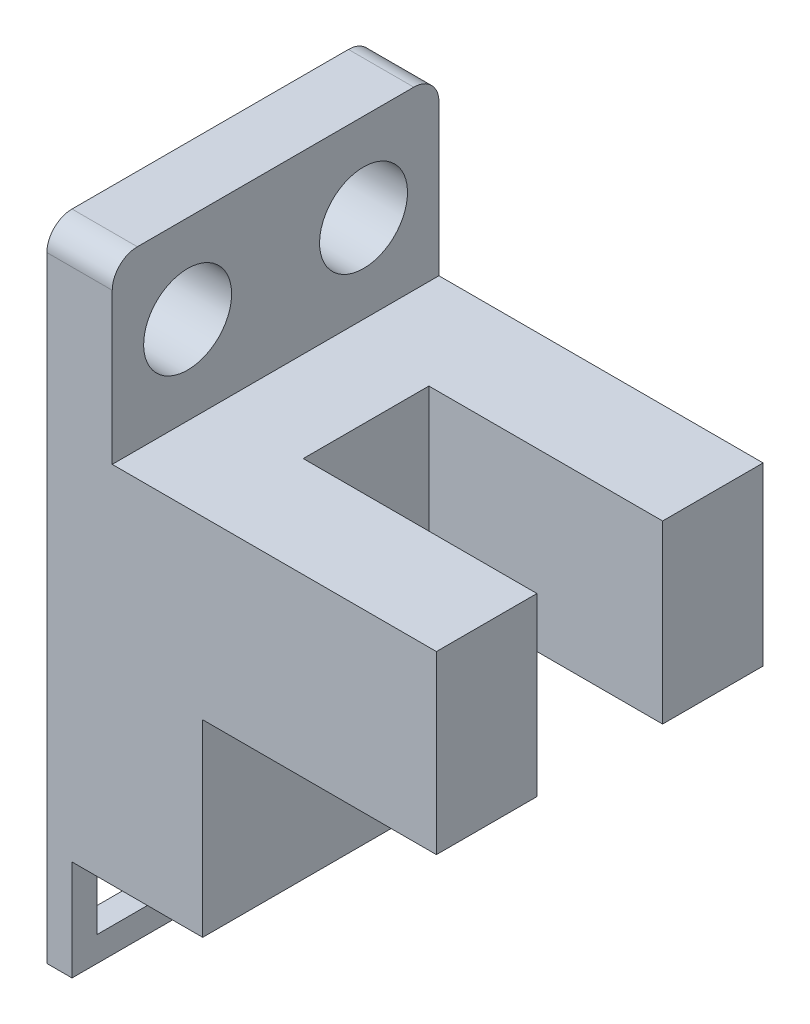
ISO-10303-21;
HEADER;
FILE_DESCRIPTION(('STEP AP214'),'2;1');
FILE_NAME('part.step','',(''),(''),'','','');
FILE_SCHEMA(('AUTOMOTIVE_DESIGN { 1 0 10303 214 1 1 1 1 }'));
ENDSEC;
DATA;
#1=APPLICATION_CONTEXT('core data for automotive mechanical design processes');
#2=APPLICATION_PROTOCOL_DEFINITION('international standard','automotive_design',2000,#1);
#3=PRODUCT_CONTEXT('',#1,'mechanical');
#4=PRODUCT('Part','Part','',(#3));
#5=PRODUCT_RELATED_PRODUCT_CATEGORY('part','',(#4));
#6=PRODUCT_DEFINITION_FORMATION('','',#4);
#7=PRODUCT_DEFINITION_CONTEXT('part definition',#1,'design');
#8=PRODUCT_DEFINITION('design','',#6,#7);
#9=PRODUCT_DEFINITION_SHAPE('','',#8);
#10=(LENGTH_UNIT() NAMED_UNIT(*) SI_UNIT(.MILLI.,.METRE.));
#11=(NAMED_UNIT(*) PLANE_ANGLE_UNIT() SI_UNIT($,.RADIAN.));
#12=(NAMED_UNIT(*) SI_UNIT($,.STERADIAN.) SOLID_ANGLE_UNIT());
#13=UNCERTAINTY_MEASURE_WITH_UNIT(LENGTH_MEASURE(1.E-05),#10,'distance_accuracy_value','');
#14=(GEOMETRIC_REPRESENTATION_CONTEXT(3) GLOBAL_UNCERTAINTY_ASSIGNED_CONTEXT((#13)) GLOBAL_UNIT_ASSIGNED_CONTEXT((#10,
#11,#12)) REPRESENTATION_CONTEXT('',''));
#15=CARTESIAN_POINT('',(0.,0.,0.));
#16=DIRECTION('',(0.,0.,1.));
#17=DIRECTION('',(1.,0.,0.));
#18=AXIS2_PLACEMENT_3D('',#15,#16,#17);
#19=CARTESIAN_POINT('',(0.,0.,6.5));
#20=DIRECTION('',(0.,1.,0.));
#21=DIRECTION('',(0.,0.,1.));
#22=AXIS2_PLACEMENT_3D('',#19,#20,#21);
#23=PLANE('',#22);
#24=DIRECTION('',(0.,0.,-1.));
#25=VECTOR('',#24,1.);
#26=CARTESIAN_POINT('',(9.3,0.,6.5));
#27=LINE('',#26,#25);
#28=CARTESIAN_POINT('',(9.3,0.,-2.5));
#29=VERTEX_POINT('',#28);
#30=CARTESIAN_POINT('',(9.3,0.,-6.5));
#31=VERTEX_POINT('',#30);
#32=EDGE_CURVE('E338',#29,#31,#27,.T.);
#33=ORIENTED_EDGE('',*,*,#32,.F.);
#34=DIRECTION('',(1.,0.,0.));
#35=VECTOR('',#34,1.);
#36=CARTESIAN_POINT('',(0.,0.,-2.5));
#37=LINE('',#36,#35);
#38=CARTESIAN_POINT('',(0.,0.,-2.5));
#39=VERTEX_POINT('',#38);
#40=EDGE_CURVE('E284',#39,#29,#37,.T.);
#41=ORIENTED_EDGE('',*,*,#40,.F.);
#42=DIRECTION('',(0.,0.,-1.));
#43=VECTOR('',#42,1.);
#44=CARTESIAN_POINT('',(0.,0.,6.5));
#45=LINE('',#44,#43);
#46=CARTESIAN_POINT('',(0.,0.,-6.5));
#47=VERTEX_POINT('',#46);
#48=EDGE_CURVE('E42',#39,#47,#45,.T.);
#49=ORIENTED_EDGE('',*,*,#48,.T.);
#50=DIRECTION('',(1.,0.,0.));
#51=VECTOR('',#50,1.);
#52=CARTESIAN_POINT('',(0.,0.,-6.5));
#53=LINE('',#52,#51);
#54=EDGE_CURVE('E321',#47,#31,#53,.T.);
#55=ORIENTED_EDGE('',*,*,#54,.T.);
#56=EDGE_LOOP('',(#33,#41,#49,#55));
#57=FACE_BOUND('',#56,.T.);
#58=ADVANCED_FACE('F34',(#57),#23,.F.);
#59=CARTESIAN_POINT('',(9.3,0.,6.5));
#60=DIRECTION('',(-1.,0.,0.));
#61=DIRECTION('',(0.,0.,1.));
#62=AXIS2_PLACEMENT_3D('',#59,#60,#61);
#63=PLANE('',#62);
#64=DIRECTION('',(0.,0.,-1.));
#65=VECTOR('',#64,1.);
#66=CARTESIAN_POINT('',(9.3,7.,6.5));
#67=LINE('',#66,#65);
#68=CARTESIAN_POINT('',(9.3,7.,-2.5));
#69=VERTEX_POINT('',#68);
#70=CARTESIAN_POINT('',(9.3,7.,-6.5));
#71=VERTEX_POINT('',#70);
#72=EDGE_CURVE('E335',#69,#71,#67,.T.);
#73=ORIENTED_EDGE('',*,*,#72,.F.);
#74=DIRECTION('',(0.,-1.,0.));
#75=VECTOR('',#74,1.);
#76=CARTESIAN_POINT('',(9.3,7.,-2.5));
#77=LINE('',#76,#75);
#78=EDGE_CURVE('E294',#69,#29,#77,.T.);
#79=ORIENTED_EDGE('',*,*,#78,.T.);
#80=ORIENTED_EDGE('',*,*,#32,.T.);
#81=DIRECTION('',(0.,1.,0.));
#82=VECTOR('',#81,1.);
#83=CARTESIAN_POINT('',(9.3,0.,-6.5));
#84=LINE('',#83,#82);
#85=EDGE_CURVE('E324',#31,#71,#84,.T.);
#86=ORIENTED_EDGE('',*,*,#85,.T.);
#87=EDGE_LOOP('',(#73,#79,#80,#86));
#88=FACE_BOUND('',#87,.T.);
#89=ADVANCED_FACE('F348',(#88),#63,.F.);
#90=CARTESIAN_POINT('',(0.,-7.5,6.5));
#91=DIRECTION('',(-1.,0.,0.));
#92=DIRECTION('',(0.,0.,1.));
#93=AXIS2_PLACEMENT_3D('',#90,#91,#92);
#94=PLANE('',#93);
#95=DIRECTION('',(0.,1.,0.));
#96=VECTOR('',#95,1.);
#97=CARTESIAN_POINT('',(0.,-7.5,-6.5));
#98=LINE('',#97,#96);
#99=CARTESIAN_POINT('',(0.,-7.5,-6.5));
#100=VERTEX_POINT('',#99);
#101=EDGE_CURVE('E297',#100,#47,#98,.T.);
#102=ORIENTED_EDGE('',*,*,#101,.T.);
#103=ORIENTED_EDGE('',*,*,#48,.F.);
#104=DIRECTION('',(0.,-1.,0.));
#105=VECTOR('',#104,1.);
#106=CARTESIAN_POINT('',(0.,7.,-2.5));
#107=LINE('',#106,#105);
#108=CARTESIAN_POINT('',(0.,7.,-2.5));
#109=VERTEX_POINT('',#108);
#110=EDGE_CURVE('E298',#109,#39,#107,.T.);
#111=ORIENTED_EDGE('',*,*,#110,.F.);
#112=DIRECTION('',(0.,0.,-1.));
#113=VECTOR('',#112,1.);
#114=CARTESIAN_POINT('',(0.,7.,2.5));
#115=LINE('',#114,#113);
#116=CARTESIAN_POINT('',(0.,7.,2.5));
#117=VERTEX_POINT('',#116);
#118=EDGE_CURVE('E283',#117,#109,#115,.T.);
#119=ORIENTED_EDGE('',*,*,#118,.F.);
#120=DIRECTION('',(0.,-1.,0.));
#121=VECTOR('',#120,1.);
#122=CARTESIAN_POINT('',(0.,7.,2.5));
#123=LINE('',#122,#121);
#124=CARTESIAN_POINT('',(0.,0.,2.5));
#125=VERTEX_POINT('',#124);
#126=EDGE_CURVE('E300',#117,#125,#123,.T.);
#127=ORIENTED_EDGE('',*,*,#126,.T.);
#128=CARTESIAN_POINT('',(0.,0.,6.5));
#129=VERTEX_POINT('',#128);
#130=EDGE_CURVE('E11',#129,#125,#45,.T.);
#131=ORIENTED_EDGE('',*,*,#130,.F.);
#132=DIRECTION('',(0.,1.,0.));
#133=VECTOR('',#132,1.);
#134=CARTESIAN_POINT('',(0.,-7.5,6.5));
#135=LINE('',#134,#133);
#136=CARTESIAN_POINT('',(0.,-7.5,6.5));
#137=VERTEX_POINT('',#136);
#138=EDGE_CURVE('E303',#137,#129,#135,.T.);
#139=ORIENTED_EDGE('',*,*,#138,.F.);
#140=DIRECTION('',(0.,0.,-1.));
#141=VECTOR('',#140,1.);
#142=CARTESIAN_POINT('',(0.,-7.5,6.5));
#143=LINE('',#142,#141);
#144=EDGE_CURVE('E318',#137,#100,#143,.T.);
#145=ORIENTED_EDGE('',*,*,#144,.T.);
#146=EDGE_LOOP('',(#102,#103,#111,#119,#127,#131,#139,#145));
#147=FACE_BOUND('',#146,.T.);
#148=ADVANCED_FACE('F36',(#147),#94,.F.);
#149=ORIENTED_EDGE('',*,*,#130,.T.);
#150=DIRECTION('',(-1.,0.,0.));
#151=VECTOR('',#150,1.);
#152=CARTESIAN_POINT('',(0.,0.,2.5));
#153=LINE('',#152,#151);
#154=CARTESIAN_POINT('',(9.3,0.,2.5));
#155=VERTEX_POINT('',#154);
#156=EDGE_CURVE('E273',#155,#125,#153,.T.);
#157=ORIENTED_EDGE('',*,*,#156,.F.);
#158=CARTESIAN_POINT('',(9.3,0.,6.5));
#159=VERTEX_POINT('',#158);
#160=EDGE_CURVE('E339',#159,#155,#27,.T.);
#161=ORIENTED_EDGE('',*,*,#160,.F.);
#162=DIRECTION('',(1.,0.,0.));
#163=VECTOR('',#162,1.);
#164=CARTESIAN_POINT('',(0.,0.,6.5));
#165=LINE('',#164,#163);
#166=EDGE_CURVE('E306',#129,#159,#165,.T.);
#167=ORIENTED_EDGE('',*,*,#166,.F.);
#168=EDGE_LOOP('',(#149,#157,#161,#167));
#169=FACE_BOUND('',#168,.T.);
#170=ADVANCED_FACE('F407',(#169),#23,.F.);
#171=ORIENTED_EDGE('',*,*,#160,.T.);
#172=DIRECTION('',(0.,-1.,0.));
#173=VECTOR('',#172,1.);
#174=CARTESIAN_POINT('',(9.3,7.,2.5));
#175=LINE('',#174,#173);
#176=CARTESIAN_POINT('',(9.3,7.,2.5));
#177=VERTEX_POINT('',#176);
#178=EDGE_CURVE('E290',#177,#155,#175,.T.);
#179=ORIENTED_EDGE('',*,*,#178,.F.);
#180=CARTESIAN_POINT('',(9.3,7.,6.5));
#181=VERTEX_POINT('',#180);
#182=EDGE_CURVE('E336',#181,#177,#67,.T.);
#183=ORIENTED_EDGE('',*,*,#182,.F.);
#184=DIRECTION('',(0.,1.,0.));
#185=VECTOR('',#184,1.);
#186=CARTESIAN_POINT('',(9.3,0.,6.5));
#187=LINE('',#186,#185);
#188=EDGE_CURVE('E309',#159,#181,#187,.T.);
#189=ORIENTED_EDGE('',*,*,#188,.F.);
#190=EDGE_LOOP('',(#171,#179,#183,#189));
#191=FACE_BOUND('',#190,.T.);
#192=ADVANCED_FACE('F412',(#191),#63,.F.);
#193=CARTESIAN_POINT('',(9.3,7.,6.5));
#194=DIRECTION('',(0.,-1.,0.));
#195=DIRECTION('',(1.,0.,0.));
#196=AXIS2_PLACEMENT_3D('',#193,#194,#195);
#197=PLANE('',#196);
#198=DIRECTION('',(-1.,0.,0.));
#199=VECTOR('',#198,1.);
#200=CARTESIAN_POINT('',(9.3,7.,-6.5));
#201=LINE('',#200,#199);
#202=CARTESIAN_POINT('',(-3.6,7.,-6.5));
#203=VERTEX_POINT('',#202);
#204=EDGE_CURVE('E327',#71,#203,#201,.T.);
#205=ORIENTED_EDGE('',*,*,#204,.T.);
#206=DIRECTION('',(0.,0.,1.));
#207=VECTOR('',#206,1.);
#208=CARTESIAN_POINT('',(-3.6,7.,6.5));
#209=LINE('',#208,#207);
#210=CARTESIAN_POINT('',(-3.6,7.,6.5));
#211=VERTEX_POINT('',#210);
#212=EDGE_CURVE('E249',#203,#211,#209,.T.);
#213=ORIENTED_EDGE('',*,*,#212,.T.);
#214=DIRECTION('',(-1.,0.,0.));
#215=VECTOR('',#214,1.);
#216=CARTESIAN_POINT('',(9.3,7.,6.5));
#217=LINE('',#216,#215);
#218=EDGE_CURVE('E311',#181,#211,#217,.T.);
#219=ORIENTED_EDGE('',*,*,#218,.F.);
#220=ORIENTED_EDGE('',*,*,#182,.T.);
#221=DIRECTION('',(-1.,0.,0.));
#222=VECTOR('',#221,1.);
#223=CARTESIAN_POINT('',(0.,7.,2.5));
#224=LINE('',#223,#222);
#225=EDGE_CURVE('E280',#177,#117,#224,.T.);
#226=ORIENTED_EDGE('',*,*,#225,.T.);
#227=ORIENTED_EDGE('',*,*,#118,.T.);
#228=DIRECTION('',(1.,0.,0.));
#229=VECTOR('',#228,1.);
#230=CARTESIAN_POINT('',(0.,7.,-2.5));
#231=LINE('',#230,#229);
#232=EDGE_CURVE('E287',#109,#69,#231,.T.);
#233=ORIENTED_EDGE('',*,*,#232,.T.);
#234=ORIENTED_EDGE('',*,*,#72,.T.);
#235=EDGE_LOOP('',(#205,#213,#219,#220,#226,#227,#233,#234));
#236=FACE_BOUND('',#235,.T.);
#237=ADVANCED_FACE('F360',(#236),#197,.F.);
#238=CARTESIAN_POINT('',(-6.2,7.,6.5));
#239=DIRECTION('',(1.,0.,0.));
#240=DIRECTION('',(0.,1.,0.));
#241=AXIS2_PLACEMENT_3D('',#238,#239,#240);
#242=PLANE('',#241);
#243=DIRECTION('',(0.,-1.,0.));
#244=VECTOR('',#243,1.);
#245=CARTESIAN_POINT('',(-6.2,7.,-6.5));
#246=LINE('',#245,#244);
#247=CARTESIAN_POINT('',(-6.2,13.,-6.5));
#248=VERTEX_POINT('',#247);
#249=CARTESIAN_POINT('',(-6.2,-11.5,-6.5));
#250=VERTEX_POINT('',#249);
#251=EDGE_CURVE('E330',#248,#250,#246,.T.);
#252=ORIENTED_EDGE('',*,*,#251,.T.);
#253=DIRECTION('',(0.,0.,1.));
#254=VECTOR('',#253,1.);
#255=CARTESIAN_POINT('',(-6.2,-11.5,6.5));
#256=LINE('',#255,#254);
#257=CARTESIAN_POINT('',(-6.2,-11.5,6.5));
#258=VERTEX_POINT('',#257);
#259=EDGE_CURVE('E213',#250,#258,#256,.T.);
#260=ORIENTED_EDGE('',*,*,#259,.T.);
#261=DIRECTION('',(0.,-1.,0.));
#262=VECTOR('',#261,1.);
#263=CARTESIAN_POINT('',(-6.2,7.,6.5));
#264=LINE('',#263,#262);
#265=CARTESIAN_POINT('',(-6.2,13.,6.5));
#266=VERTEX_POINT('',#265);
#267=EDGE_CURVE('E314',#266,#258,#264,.T.);
#268=ORIENTED_EDGE('',*,*,#267,.F.);
#269=CARTESIAN_POINT('',(-6.2,13.,5.5));
#270=DIRECTION('',(-1.,0.,0.));
#271=DIRECTION('',(0.,-1.,0.));
#272=AXIS2_PLACEMENT_3D('',#269,#270,#271);
#273=CIRCLE('',#272,1.);
#274=CARTESIAN_POINT('',(-6.2,14.,5.49999999999999));
#275=VERTEX_POINT('',#274);
#276=EDGE_CURVE('E243',#266,#275,#273,.T.);
#277=ORIENTED_EDGE('',*,*,#276,.T.);
#278=DIRECTION('',(0.,0.,-1.));
#279=VECTOR('',#278,1.);
#280=CARTESIAN_POINT('',(-6.2,14.,5.49999999999999));
#281=LINE('',#280,#279);
#282=CARTESIAN_POINT('',(-6.2,14.,-5.49999999999999));
#283=VERTEX_POINT('',#282);
#284=EDGE_CURVE('E265',#275,#283,#281,.T.);
#285=ORIENTED_EDGE('',*,*,#284,.T.);
#286=CARTESIAN_POINT('',(-6.2,13.,-5.5));
#287=DIRECTION('',(-1.,0.,0.));
#288=DIRECTION('',(0.,1.,0.));
#289=AXIS2_PLACEMENT_3D('',#286,#287,#288);
#290=CIRCLE('',#289,1.);
#291=EDGE_CURVE('E250',#283,#248,#290,.T.);
#292=ORIENTED_EDGE('',*,*,#291,.T.);
#293=EDGE_LOOP('',(#252,#260,#268,#277,#285,#292));
#294=FACE_BOUND('',#293,.T.);
#295=CARTESIAN_POINT('',(-6.2,10.5,3.5));
#296=DIRECTION('',(-1.,0.,0.));
#297=DIRECTION('',(0.,1.,0.));
#298=AXIS2_PLACEMENT_3D('',#295,#296,#297);
#299=CIRCLE('',#298,1.75);
#300=CARTESIAN_POINT('',(-6.2,12.25,3.5));
#301=VERTEX_POINT('',#300);
#302=EDGE_CURVE('E231',#301,#301,#299,.T.);
#303=ORIENTED_EDGE('',*,*,#302,.F.);
#304=EDGE_LOOP('',(#303));
#305=FACE_BOUND('',#304,.T.);
#306=CARTESIAN_POINT('',(-6.2,10.5,-3.5));
#307=DIRECTION('',(-1.,0.,0.));
#308=DIRECTION('',(0.,-1.,0.));
#309=AXIS2_PLACEMENT_3D('',#306,#307,#308);
#310=CIRCLE('',#309,1.75);
#311=CARTESIAN_POINT('',(-6.2,8.75,-3.5));
#312=VERTEX_POINT('',#311);
#313=EDGE_CURVE('E237',#312,#312,#310,.T.);
#314=ORIENTED_EDGE('',*,*,#313,.F.);
#315=EDGE_LOOP('',(#314));
#316=FACE_BOUND('',#315,.T.);
#317=DIRECTION('',(0.,0.,1.));
#318=VECTOR('',#317,1.);
#319=CARTESIAN_POINT('',(-6.2,-10.5,5.5));
#320=LINE('',#319,#318);
#321=CARTESIAN_POINT('',(-6.2,-10.5,-5.5));
#322=VERTEX_POINT('',#321);
#323=CARTESIAN_POINT('',(-6.2,-10.5,5.5));
#324=VERTEX_POINT('',#323);
#325=EDGE_CURVE('E181',#322,#324,#320,.T.);
#326=ORIENTED_EDGE('',*,*,#325,.F.);
#327=DIRECTION('',(0.,-1.,0.));
#328=VECTOR('',#327,1.);
#329=CARTESIAN_POINT('',(-6.2,-10.5,-5.5));
#330=LINE('',#329,#328);
#331=CARTESIAN_POINT('',(-6.2,-8.5,-5.5));
#332=VERTEX_POINT('',#331);
#333=EDGE_CURVE('E198',#332,#322,#330,.T.);
#334=ORIENTED_EDGE('',*,*,#333,.F.);
#335=DIRECTION('',(0.,0.,-1.));
#336=VECTOR('',#335,1.);
#337=CARTESIAN_POINT('',(-6.2,-8.5,5.5));
#338=LINE('',#337,#336);
#339=CARTESIAN_POINT('',(-6.2,-8.5,5.5));
#340=VERTEX_POINT('',#339);
#341=EDGE_CURVE('E201',#340,#332,#338,.T.);
#342=ORIENTED_EDGE('',*,*,#341,.F.);
#343=DIRECTION('',(0.,1.,0.));
#344=VECTOR('',#343,1.);
#345=CARTESIAN_POINT('',(-6.2,-10.5,5.5));
#346=LINE('',#345,#344);
#347=EDGE_CURVE('E207',#324,#340,#346,.T.);
#348=ORIENTED_EDGE('',*,*,#347,.F.);
#349=EDGE_LOOP('',(#326,#334,#342,#348));
#350=FACE_BOUND('',#349,.T.);
#351=ADVANCED_FACE('F382',(#294,#305,#316,#350),#242,.F.);
#352=CARTESIAN_POINT('',(-6.2,-7.5,6.5));
#353=DIRECTION('',(0.,1.,0.));
#354=DIRECTION('',(0.,0.,1.));
#355=AXIS2_PLACEMENT_3D('',#352,#353,#354);
#356=PLANE('',#355);
#357=DIRECTION('',(1.,0.,0.));
#358=VECTOR('',#357,1.);
#359=CARTESIAN_POINT('',(-6.2,-7.5,6.5));
#360=LINE('',#359,#358);
#361=CARTESIAN_POINT('',(-5.2,-7.5,6.5));
#362=VERTEX_POINT('',#361);
#363=EDGE_CURVE('E316',#362,#137,#360,.T.);
#364=ORIENTED_EDGE('',*,*,#363,.F.);
#365=DIRECTION('',(0.,0.,-1.));
#366=VECTOR('',#365,1.);
#367=CARTESIAN_POINT('',(-5.2,-7.5,6.5));
#368=LINE('',#367,#366);
#369=CARTESIAN_POINT('',(-5.2,-7.5,-6.5));
#370=VERTEX_POINT('',#369);
#371=EDGE_CURVE('E223',#362,#370,#368,.T.);
#372=ORIENTED_EDGE('',*,*,#371,.T.);
#373=DIRECTION('',(1.,0.,0.));
#374=VECTOR('',#373,1.);
#375=CARTESIAN_POINT('',(-6.2,-7.5,-6.5));
#376=LINE('',#375,#374);
#377=EDGE_CURVE('E307',#370,#100,#376,.T.);
#378=ORIENTED_EDGE('',*,*,#377,.T.);
#379=ORIENTED_EDGE('',*,*,#144,.F.);
#380=EDGE_LOOP('',(#364,#372,#378,#379));
#381=FACE_BOUND('',#380,.T.);
#382=ADVANCED_FACE('F371',(#381),#356,.F.);
#383=CARTESIAN_POINT('',(0.,0.,6.5));
#384=DIRECTION('',(0.,0.,-1.));
#385=DIRECTION('',(-1.,0.,0.));
#386=AXIS2_PLACEMENT_3D('',#383,#384,#385);
#387=PLANE('',#386);
#388=ORIENTED_EDGE('',*,*,#138,.T.);
#389=ORIENTED_EDGE('',*,*,#166,.T.);
#390=ORIENTED_EDGE('',*,*,#188,.T.);
#391=ORIENTED_EDGE('',*,*,#218,.T.);
#392=DIRECTION('',(0.,1.,0.));
#393=VECTOR('',#392,1.);
#394=CARTESIAN_POINT('',(-3.6,13.,6.5));
#395=LINE('',#394,#393);
#396=CARTESIAN_POINT('',(-3.6,13.,6.5));
#397=VERTEX_POINT('',#396);
#398=EDGE_CURVE('E57',#211,#397,#395,.T.);
#399=ORIENTED_EDGE('',*,*,#398,.T.);
#400=DIRECTION('',(-1.,0.,0.));
#401=VECTOR('',#400,1.);
#402=CARTESIAN_POINT('',(-3.6,13.,6.5));
#403=LINE('',#402,#401);
#404=EDGE_CURVE('E262',#397,#266,#403,.T.);
#405=ORIENTED_EDGE('',*,*,#404,.T.);
#406=ORIENTED_EDGE('',*,*,#267,.T.);
#407=DIRECTION('',(-1.,0.,0.));
#408=VECTOR('',#407,1.);
#409=CARTESIAN_POINT('',(-5.2,-11.5,6.5));
#410=LINE('',#409,#408);
#411=CARTESIAN_POINT('',(-5.2,-11.5,6.5));
#412=VERTEX_POINT('',#411);
#413=EDGE_CURVE('E228',#412,#258,#410,.T.);
#414=ORIENTED_EDGE('',*,*,#413,.F.);
#415=DIRECTION('',(0.,1.,0.));
#416=VECTOR('',#415,1.);
#417=CARTESIAN_POINT('',(-5.2,-11.5,6.5));
#418=LINE('',#417,#416);
#419=EDGE_CURVE('E221',#412,#362,#418,.T.);
#420=ORIENTED_EDGE('',*,*,#419,.T.);
#421=ORIENTED_EDGE('',*,*,#363,.T.);
#422=EDGE_LOOP('',(#388,#389,#390,#391,#399,#405,#406,#414,#420,#421));
#423=FACE_BOUND('',#422,.T.);
#424=ADVANCED_FACE('F425',(#423),#387,.F.);
#425=CARTESIAN_POINT('',(0.,0.,-6.5));
#426=DIRECTION('',(0.,0.,-1.));
#427=DIRECTION('',(-1.,0.,0.));
#428=AXIS2_PLACEMENT_3D('',#425,#426,#427);
#429=PLANE('',#428);
#430=ORIENTED_EDGE('',*,*,#101,.F.);
#431=ORIENTED_EDGE('',*,*,#377,.F.);
#432=DIRECTION('',(0.,-1.,0.));
#433=VECTOR('',#432,1.);
#434=CARTESIAN_POINT('',(-5.2,-11.5,-6.5));
#435=LINE('',#434,#433);
#436=CARTESIAN_POINT('',(-5.2,-11.5,-6.5));
#437=VERTEX_POINT('',#436);
#438=EDGE_CURVE('E49',#370,#437,#435,.T.);
#439=ORIENTED_EDGE('',*,*,#438,.T.);
#440=DIRECTION('',(-1.,0.,0.));
#441=VECTOR('',#440,1.);
#442=CARTESIAN_POINT('',(-5.2,-11.5,-6.5));
#443=LINE('',#442,#441);
#444=EDGE_CURVE('E225',#437,#250,#443,.T.);
#445=ORIENTED_EDGE('',*,*,#444,.T.);
#446=ORIENTED_EDGE('',*,*,#251,.F.);
#447=DIRECTION('',(-1.,0.,0.));
#448=VECTOR('',#447,1.);
#449=CARTESIAN_POINT('',(-3.6,13.,-6.5));
#450=LINE('',#449,#448);
#451=CARTESIAN_POINT('',(-3.6,13.,-6.5));
#452=VERTEX_POINT('',#451);
#453=EDGE_CURVE('E270',#452,#248,#450,.T.);
#454=ORIENTED_EDGE('',*,*,#453,.F.);
#455=DIRECTION('',(0.,-1.,0.));
#456=VECTOR('',#455,1.);
#457=CARTESIAN_POINT('',(-3.6,13.,-6.5));
#458=LINE('',#457,#456);
#459=EDGE_CURVE('E246',#452,#203,#458,.T.);
#460=ORIENTED_EDGE('',*,*,#459,.T.);
#461=ORIENTED_EDGE('',*,*,#204,.F.);
#462=ORIENTED_EDGE('',*,*,#85,.F.);
#463=ORIENTED_EDGE('',*,*,#54,.F.);
#464=EDGE_LOOP('',(#430,#431,#439,#445,#446,#454,#460,#461,#462,#463));
#465=FACE_BOUND('',#464,.T.);
#466=ADVANCED_FACE('F357',(#465),#429,.T.);
#467=CARTESIAN_POINT('',(0.,7.,-2.5));
#468=DIRECTION('',(0.,0.,-1.));
#469=DIRECTION('',(-1.,0.,0.));
#470=AXIS2_PLACEMENT_3D('',#467,#468,#469);
#471=PLANE('',#470);
#472=ORIENTED_EDGE('',*,*,#40,.T.);
#473=ORIENTED_EDGE('',*,*,#78,.F.);
#474=ORIENTED_EDGE('',*,*,#232,.F.);
#475=ORIENTED_EDGE('',*,*,#110,.T.);
#476=EDGE_LOOP('',(#472,#473,#474,#475));
#477=FACE_BOUND('',#476,.T.);
#478=ADVANCED_FACE('F364',(#477),#471,.F.);
#479=CARTESIAN_POINT('',(0.,7.,2.5));
#480=DIRECTION('',(0.,0.,1.));
#481=DIRECTION('',(1.,0.,0.));
#482=AXIS2_PLACEMENT_3D('',#479,#480,#481);
#483=PLANE('',#482);
#484=ORIENTED_EDGE('',*,*,#156,.T.);
#485=ORIENTED_EDGE('',*,*,#126,.F.);
#486=ORIENTED_EDGE('',*,*,#225,.F.);
#487=ORIENTED_EDGE('',*,*,#178,.T.);
#488=EDGE_LOOP('',(#484,#485,#486,#487));
#489=FACE_BOUND('',#488,.T.);
#490=ADVANCED_FACE('F423',(#489),#483,.F.);
#491=CARTESIAN_POINT('',(-3.6,13.,-5.5));
#492=DIRECTION('',(-1.,0.,0.));
#493=DIRECTION('',(0.,-1.,0.));
#494=AXIS2_PLACEMENT_3D('',#491,#492,#493);
#495=CYLINDRICAL_SURFACE('',#494,1.);
#496=ORIENTED_EDGE('',*,*,#291,.F.);
#497=DIRECTION('',(-1.,0.,0.));
#498=VECTOR('',#497,1.);
#499=CARTESIAN_POINT('',(-3.6,14.,-5.49999999999999));
#500=LINE('',#499,#498);
#501=CARTESIAN_POINT('',(-3.6,14.,-5.49999999999999));
#502=VERTEX_POINT('',#501);
#503=EDGE_CURVE('E274',#502,#283,#500,.T.);
#504=ORIENTED_EDGE('',*,*,#503,.F.);
#505=CARTESIAN_POINT('',(-3.6,13.,-5.5));
#506=DIRECTION('',(-1.,0.,0.));
#507=DIRECTION('',(0.,1.,0.));
#508=AXIS2_PLACEMENT_3D('',#505,#506,#507);
#509=CIRCLE('',#508,1.);
#510=EDGE_CURVE('E259',#502,#452,#509,.T.);
#511=ORIENTED_EDGE('',*,*,#510,.T.);
#512=ORIENTED_EDGE('',*,*,#453,.T.);
#513=EDGE_LOOP('',(#496,#504,#511,#512));
#514=FACE_BOUND('',#513,.T.);
#515=ADVANCED_FACE('F380',(#514),#495,.T.);
#516=CARTESIAN_POINT('',(-3.6,14.,5.49999999999999));
#517=DIRECTION('',(0.,1.,0.));
#518=DIRECTION('',(-1.,0.,0.));
#519=AXIS2_PLACEMENT_3D('',#516,#517,#518);
#520=PLANE('',#519);
#521=ORIENTED_EDGE('',*,*,#284,.F.);
#522=DIRECTION('',(-1.,0.,0.));
#523=VECTOR('',#522,1.);
#524=CARTESIAN_POINT('',(-3.6,14.,5.49999999999999));
#525=LINE('',#524,#523);
#526=CARTESIAN_POINT('',(-3.6,14.,5.49999999999999));
#527=VERTEX_POINT('',#526);
#528=EDGE_CURVE('E276',#527,#275,#525,.T.);
#529=ORIENTED_EDGE('',*,*,#528,.F.);
#530=DIRECTION('',(0.,0.,-1.));
#531=VECTOR('',#530,1.);
#532=CARTESIAN_POINT('',(-3.6,14.,5.49999999999999));
#533=LINE('',#532,#531);
#534=EDGE_CURVE('E256',#527,#502,#533,.T.);
#535=ORIENTED_EDGE('',*,*,#534,.T.);
#536=ORIENTED_EDGE('',*,*,#503,.T.);
#537=EDGE_LOOP('',(#521,#529,#535,#536));
#538=FACE_BOUND('',#537,.T.);
#539=ADVANCED_FACE('F387',(#538),#520,.T.);
#540=CARTESIAN_POINT('',(-3.6,13.,5.5));
#541=DIRECTION('',(-1.,0.,0.));
#542=DIRECTION('',(0.,-1.,0.));
#543=AXIS2_PLACEMENT_3D('',#540,#541,#542);
#544=CYLINDRICAL_SURFACE('',#543,1.);
#545=ORIENTED_EDGE('',*,*,#276,.F.);
#546=ORIENTED_EDGE('',*,*,#404,.F.);
#547=CARTESIAN_POINT('',(-3.6,13.,5.5));
#548=DIRECTION('',(-1.,0.,0.));
#549=DIRECTION('',(0.,-1.,0.));
#550=AXIS2_PLACEMENT_3D('',#547,#548,#549);
#551=CIRCLE('',#550,1.);
#552=EDGE_CURVE('E253',#397,#527,#551,.T.);
#553=ORIENTED_EDGE('',*,*,#552,.T.);
#554=ORIENTED_EDGE('',*,*,#528,.T.);
#555=EDGE_LOOP('',(#545,#546,#553,#554));
#556=FACE_BOUND('',#555,.T.);
#557=ADVANCED_FACE('F392',(#556),#544,.T.);
#558=CARTESIAN_POINT('',(-3.6,13.,5.5));
#559=DIRECTION('',(-1.,0.,0.));
#560=DIRECTION('',(0.,-1.,0.));
#561=AXIS2_PLACEMENT_3D('',#558,#559,#560);
#562=PLANE('',#561);
#563=CARTESIAN_POINT('',(-3.6,10.5,3.5));
#564=DIRECTION('',(-1.,0.,0.));
#565=DIRECTION('',(0.,1.,0.));
#566=AXIS2_PLACEMENT_3D('',#563,#564,#565);
#567=CIRCLE('',#566,1.75);
#568=CARTESIAN_POINT('',(-3.6,12.25,3.5));
#569=VERTEX_POINT('',#568);
#570=EDGE_CURVE('E234',#569,#569,#567,.T.);
#571=ORIENTED_EDGE('',*,*,#570,.T.);
#572=EDGE_LOOP('',(#571));
#573=FACE_BOUND('',#572,.T.);
#574=CARTESIAN_POINT('',(-3.6,10.5,-3.5));
#575=DIRECTION('',(-1.,0.,0.));
#576=DIRECTION('',(0.,-1.,0.));
#577=AXIS2_PLACEMENT_3D('',#574,#575,#576);
#578=CIRCLE('',#577,1.75);
#579=CARTESIAN_POINT('',(-3.6,8.75,-3.5));
#580=VERTEX_POINT('',#579);
#581=EDGE_CURVE('E240',#580,#580,#578,.T.);
#582=ORIENTED_EDGE('',*,*,#581,.T.);
#583=EDGE_LOOP('',(#582));
#584=FACE_BOUND('',#583,.T.);
#585=ORIENTED_EDGE('',*,*,#459,.F.);
#586=ORIENTED_EDGE('',*,*,#510,.F.);
#587=ORIENTED_EDGE('',*,*,#534,.F.);
#588=ORIENTED_EDGE('',*,*,#552,.F.);
#589=ORIENTED_EDGE('',*,*,#398,.F.);
#590=ORIENTED_EDGE('',*,*,#212,.F.);
#591=EDGE_LOOP('',(#585,#586,#587,#588,#589,#590));
#592=FACE_BOUND('',#591,.T.);
#593=ADVANCED_FACE('F389',(#573,#584,#592),#562,.F.);
#594=CARTESIAN_POINT('',(-3.6,10.5,-3.5));
#595=DIRECTION('',(-1.,0.,0.));
#596=DIRECTION('',(0.,-1.,0.));
#597=AXIS2_PLACEMENT_3D('',#594,#595,#596);
#598=CYLINDRICAL_SURFACE('',#597,1.75);
#599=ORIENTED_EDGE('',*,*,#581,.F.);
#600=EDGE_LOOP('',(#599));
#601=FACE_BOUND('',#600,.T.);
#602=ORIENTED_EDGE('',*,*,#313,.T.);
#603=EDGE_LOOP('',(#602));
#604=FACE_BOUND('',#603,.T.);
#605=ADVANCED_FACE('F391',(#601,#604),#598,.F.);
#606=CARTESIAN_POINT('',(-3.6,10.5,3.5));
#607=DIRECTION('',(-1.,0.,0.));
#608=DIRECTION('',(0.,-1.,0.));
#609=AXIS2_PLACEMENT_3D('',#606,#607,#608);
#610=CYLINDRICAL_SURFACE('',#609,1.75);
#611=ORIENTED_EDGE('',*,*,#570,.F.);
#612=EDGE_LOOP('',(#611));
#613=FACE_BOUND('',#612,.T.);
#614=ORIENTED_EDGE('',*,*,#302,.T.);
#615=EDGE_LOOP('',(#614));
#616=FACE_BOUND('',#615,.T.);
#617=ADVANCED_FACE('F399',(#613,#616),#610,.F.);
#618=CARTESIAN_POINT('',(-5.2,-11.5,6.5));
#619=DIRECTION('',(0.,-1.,0.));
#620=DIRECTION('',(1.,0.,0.));
#621=AXIS2_PLACEMENT_3D('',#618,#619,#620);
#622=PLANE('',#621);
#623=ORIENTED_EDGE('',*,*,#259,.F.);
#624=ORIENTED_EDGE('',*,*,#444,.F.);
#625=DIRECTION('',(0.,0.,1.));
#626=VECTOR('',#625,1.);
#627=CARTESIAN_POINT('',(-5.2,-11.5,6.5));
#628=LINE('',#627,#626);
#629=EDGE_CURVE('E218',#437,#412,#628,.T.);
#630=ORIENTED_EDGE('',*,*,#629,.T.);
#631=ORIENTED_EDGE('',*,*,#413,.T.);
#632=EDGE_LOOP('',(#623,#624,#630,#631));
#633=FACE_BOUND('',#632,.T.);
#634=ADVANCED_FACE('F376',(#633),#622,.T.);
#635=CARTESIAN_POINT('',(-5.2,0.,0.));
#636=DIRECTION('',(-1.,0.,0.));
#637=DIRECTION('',(0.,-1.,0.));
#638=AXIS2_PLACEMENT_3D('',#635,#636,#637);
#639=PLANE('',#638);
#640=DIRECTION('',(0.,-1.,0.));
#641=VECTOR('',#640,1.);
#642=CARTESIAN_POINT('',(-5.2,-10.5,-5.5));
#643=LINE('',#642,#641);
#644=CARTESIAN_POINT('',(-5.2,-8.5,-5.5));
#645=VERTEX_POINT('',#644);
#646=CARTESIAN_POINT('',(-5.2,-10.5,-5.5));
#647=VERTEX_POINT('',#646);
#648=EDGE_CURVE('E186',#645,#647,#643,.T.);
#649=ORIENTED_EDGE('',*,*,#648,.T.);
#650=DIRECTION('',(0.,0.,1.));
#651=VECTOR('',#650,1.);
#652=CARTESIAN_POINT('',(-5.2,-10.5,5.5));
#653=LINE('',#652,#651);
#654=CARTESIAN_POINT('',(-5.2,-10.5,5.5));
#655=VERTEX_POINT('',#654);
#656=EDGE_CURVE('E178',#647,#655,#653,.T.);
#657=ORIENTED_EDGE('',*,*,#656,.T.);
#658=DIRECTION('',(0.,1.,0.));
#659=VECTOR('',#658,1.);
#660=CARTESIAN_POINT('',(-5.2,-10.5,5.5));
#661=LINE('',#660,#659);
#662=CARTESIAN_POINT('',(-5.2,-8.5,5.5));
#663=VERTEX_POINT('',#662);
#664=EDGE_CURVE('E190',#655,#663,#661,.T.);
#665=ORIENTED_EDGE('',*,*,#664,.T.);
#666=DIRECTION('',(0.,0.,-1.));
#667=VECTOR('',#666,1.);
#668=CARTESIAN_POINT('',(-5.2,-8.5,5.5));
#669=LINE('',#668,#667);
#670=EDGE_CURVE('E194',#663,#645,#669,.T.);
#671=ORIENTED_EDGE('',*,*,#670,.T.);
#672=EDGE_LOOP('',(#649,#657,#665,#671));
#673=FACE_BOUND('',#672,.T.);
#674=ORIENTED_EDGE('',*,*,#438,.F.);
#675=ORIENTED_EDGE('',*,*,#371,.F.);
#676=ORIENTED_EDGE('',*,*,#419,.F.);
#677=ORIENTED_EDGE('',*,*,#629,.F.);
#678=EDGE_LOOP('',(#674,#675,#676,#677));
#679=FACE_BOUND('',#678,.T.);
#680=ADVANCED_FACE('F196',(#673,#679),#639,.F.);
#681=CARTESIAN_POINT('',(-5.2,-10.5,5.5));
#682=DIRECTION('',(0.,-1.,0.));
#683=DIRECTION('',(1.,0.,0.));
#684=AXIS2_PLACEMENT_3D('',#681,#682,#683);
#685=PLANE('',#684);
#686=ORIENTED_EDGE('',*,*,#325,.T.);
#687=DIRECTION('',(-1.,0.,0.));
#688=VECTOR('',#687,1.);
#689=CARTESIAN_POINT('',(-5.2,-10.5,5.5));
#690=LINE('',#689,#688);
#691=EDGE_CURVE('E174',#655,#324,#690,.T.);
#692=ORIENTED_EDGE('',*,*,#691,.F.);
#693=ORIENTED_EDGE('',*,*,#656,.F.);
#694=DIRECTION('',(-1.,0.,0.));
#695=VECTOR('',#694,1.);
#696=CARTESIAN_POINT('',(-5.2,-10.5,-5.5));
#697=LINE('',#696,#695);
#698=EDGE_CURVE('E211',#647,#322,#697,.T.);
#699=ORIENTED_EDGE('',*,*,#698,.T.);
#700=EDGE_LOOP('',(#686,#692,#693,#699));
#701=FACE_BOUND('',#700,.T.);
#702=ADVANCED_FACE('F176',(#701),#685,.F.);
#703=CARTESIAN_POINT('',(-5.2,-10.5,-5.5));
#704=DIRECTION('',(0.,0.,-1.));
#705=DIRECTION('',(0.,1.,0.));
#706=AXIS2_PLACEMENT_3D('',#703,#704,#705);
#707=PLANE('',#706);
#708=ORIENTED_EDGE('',*,*,#333,.T.);
#709=ORIENTED_EDGE('',*,*,#698,.F.);
#710=ORIENTED_EDGE('',*,*,#648,.F.);
#711=DIRECTION('',(-1.,0.,0.));
#712=VECTOR('',#711,1.);
#713=CARTESIAN_POINT('',(-5.2,-8.5,-5.5));
#714=LINE('',#713,#712);
#715=EDGE_CURVE('E214',#645,#332,#714,.T.);
#716=ORIENTED_EDGE('',*,*,#715,.T.);
#717=EDGE_LOOP('',(#708,#709,#710,#716));
#718=FACE_BOUND('',#717,.T.);
#719=ADVANCED_FACE('F496',(#718),#707,.F.);
#720=CARTESIAN_POINT('',(-5.2,-8.5,5.5));
#721=DIRECTION('',(0.,1.,0.));
#722=DIRECTION('',(-1.,0.,0.));
#723=AXIS2_PLACEMENT_3D('',#720,#721,#722);
#724=PLANE('',#723);
#725=ORIENTED_EDGE('',*,*,#341,.T.);
#726=ORIENTED_EDGE('',*,*,#715,.F.);
#727=ORIENTED_EDGE('',*,*,#670,.F.);
#728=DIRECTION('',(-1.,0.,0.));
#729=VECTOR('',#728,1.);
#730=CARTESIAN_POINT('',(-5.2,-8.5,5.5));
#731=LINE('',#730,#729);
#732=EDGE_CURVE('E185',#663,#340,#731,.T.);
#733=ORIENTED_EDGE('',*,*,#732,.T.);
#734=EDGE_LOOP('',(#725,#726,#727,#733));
#735=FACE_BOUND('',#734,.T.);
#736=ADVANCED_FACE('F505',(#735),#724,.F.);
#737=CARTESIAN_POINT('',(-5.2,-10.5,5.5));
#738=DIRECTION('',(0.,0.,1.));
#739=DIRECTION('',(1.,0.,0.));
#740=AXIS2_PLACEMENT_3D('',#737,#738,#739);
#741=PLANE('',#740);
#742=ORIENTED_EDGE('',*,*,#347,.T.);
#743=ORIENTED_EDGE('',*,*,#732,.F.);
#744=ORIENTED_EDGE('',*,*,#664,.F.);
#745=ORIENTED_EDGE('',*,*,#691,.T.);
#746=EDGE_LOOP('',(#742,#743,#744,#745));
#747=FACE_BOUND('',#746,.T.);
#748=ADVANCED_FACE('F191',(#747),#741,.F.);
#749=CLOSED_SHELL('',(#58,#89,#148,#170,#192,#237,#351,#382,#424,#466,#478,#490,#515,#539,#557,
#593,#605,#617,#634,#680,#702,#719,#736,#748));
#750=MANIFOLD_SOLID_BREP('B2',#749);
#751=ADVANCED_BREP_SHAPE_REPRESENTATION('',(#18,#750),#14);
#752=SHAPE_DEFINITION_REPRESENTATION(#9,#751);
ENDSEC;
END-ISO-10303-21;
